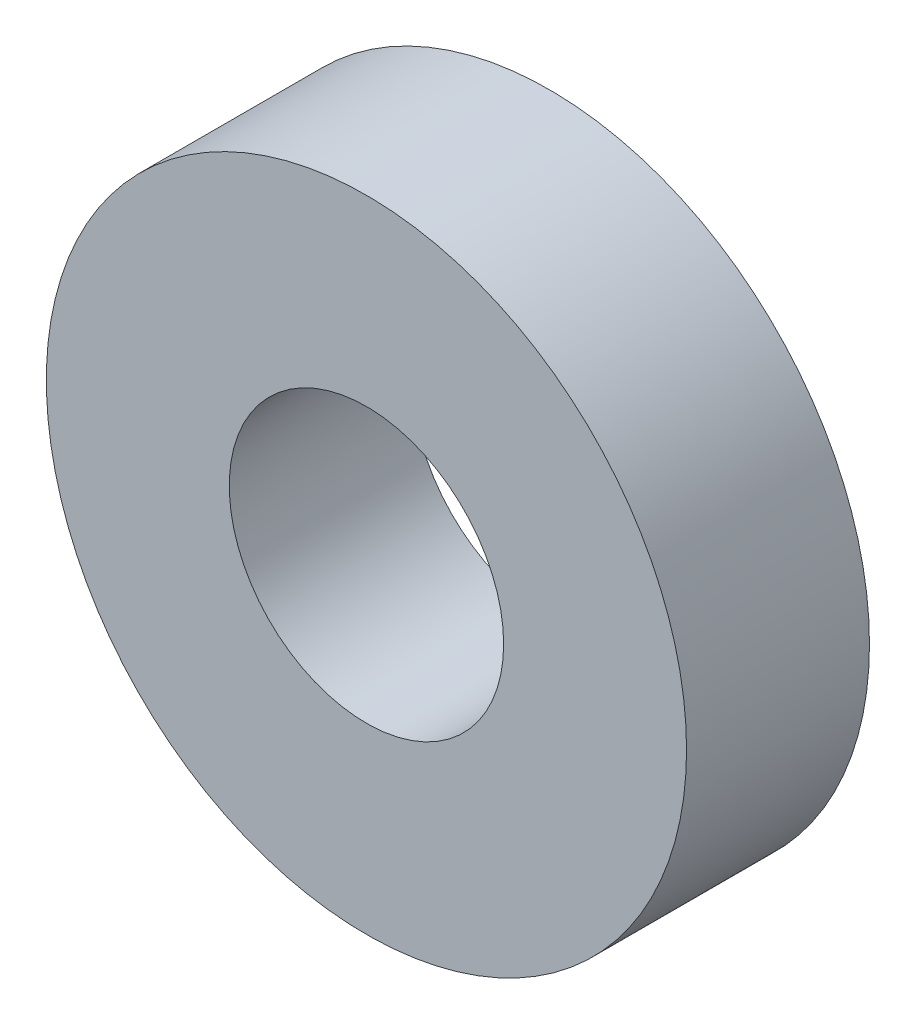
ISO-10303-21;
HEADER;
FILE_DESCRIPTION(('STEP AP214'),'2;1');
FILE_NAME('part.step','',(''),(''),'','','');
FILE_SCHEMA(('AUTOMOTIVE_DESIGN { 1 0 10303 214 1 1 1 1 }'));
ENDSEC;
DATA;
#1=APPLICATION_CONTEXT('core data for automotive mechanical design processes');
#2=APPLICATION_PROTOCOL_DEFINITION('international standard','automotive_design',2000,#1);
#3=PRODUCT_CONTEXT('',#1,'mechanical');
#4=PRODUCT('Part','Part','',(#3));
#5=PRODUCT_RELATED_PRODUCT_CATEGORY('part','',(#4));
#6=PRODUCT_DEFINITION_FORMATION('','',#4);
#7=PRODUCT_DEFINITION_CONTEXT('part definition',#1,'design');
#8=PRODUCT_DEFINITION('design','',#6,#7);
#9=PRODUCT_DEFINITION_SHAPE('','',#8);
#10=(LENGTH_UNIT() NAMED_UNIT(*) SI_UNIT(.MILLI.,.METRE.));
#11=(NAMED_UNIT(*) PLANE_ANGLE_UNIT() SI_UNIT($,.RADIAN.));
#12=(NAMED_UNIT(*) SI_UNIT($,.STERADIAN.) SOLID_ANGLE_UNIT());
#13=UNCERTAINTY_MEASURE_WITH_UNIT(LENGTH_MEASURE(1.E-05),#10,'distance_accuracy_value','');
#14=(GEOMETRIC_REPRESENTATION_CONTEXT(3) GLOBAL_UNCERTAINTY_ASSIGNED_CONTEXT((#13)) GLOBAL_UNIT_ASSIGNED_CONTEXT((#10,
#11,#12)) REPRESENTATION_CONTEXT('',''));
#15=CARTESIAN_POINT('',(0.,0.,0.));
#16=DIRECTION('',(0.,0.,1.));
#17=DIRECTION('',(1.,0.,0.));
#18=AXIS2_PLACEMENT_3D('',#15,#16,#17);
#19=CARTESIAN_POINT('',(0.,0.,2.54));
#20=DIRECTION('',(0.,0.,1.));
#21=DIRECTION('',(1.,0.,0.));
#22=AXIS2_PLACEMENT_3D('',#19,#20,#21);
#23=PLANE('',#22);
#24=CARTESIAN_POINT('',(0.,0.,2.54));
#25=DIRECTION('',(0.,0.,1.));
#26=DIRECTION('',(1.,0.,0.));
#27=AXIS2_PLACEMENT_3D('',#24,#25,#26);
#28=CIRCLE('',#27,4.445);
#29=CARTESIAN_POINT('',(4.445,0.,2.54));
#30=VERTEX_POINT('',#29);
#31=EDGE_CURVE('E10',#30,#30,#28,.T.);
#32=ORIENTED_EDGE('',*,*,#31,.T.);
#33=EDGE_LOOP('',(#32));
#34=FACE_BOUND('',#33,.T.);
#35=CARTESIAN_POINT('',(0.,0.,2.54));
#36=DIRECTION('',(0.,0.,1.));
#37=DIRECTION('',(1.,0.,0.));
#38=AXIS2_PLACEMENT_3D('',#35,#36,#37);
#39=CIRCLE('',#38,1.905);
#40=CARTESIAN_POINT('',(1.905,0.,2.54));
#41=VERTEX_POINT('',#40);
#42=EDGE_CURVE('E50',#41,#41,#39,.T.);
#43=ORIENTED_EDGE('',*,*,#42,.F.);
#44=EDGE_LOOP('',(#43));
#45=FACE_BOUND('',#44,.T.);
#46=ADVANCED_FACE('F37',(#34,#45),#23,.T.);
#47=CARTESIAN_POINT('',(0.,0.,0.));
#48=DIRECTION('',(0.,0.,1.));
#49=DIRECTION('',(1.,0.,0.));
#50=AXIS2_PLACEMENT_3D('',#47,#48,#49);
#51=PLANE('',#50);
#52=CARTESIAN_POINT('',(0.,0.,0.));
#53=DIRECTION('',(0.,0.,1.));
#54=DIRECTION('',(1.,0.,0.));
#55=AXIS2_PLACEMENT_3D('',#52,#53,#54);
#56=CIRCLE('',#55,4.445);
#57=CARTESIAN_POINT('',(4.445,0.,0.));
#58=VERTEX_POINT('',#57);
#59=EDGE_CURVE('E41',#58,#58,#56,.T.);
#60=ORIENTED_EDGE('',*,*,#59,.F.);
#61=EDGE_LOOP('',(#60));
#62=FACE_BOUND('',#61,.T.);
#63=CARTESIAN_POINT('',(0.,0.,0.));
#64=DIRECTION('',(0.,0.,1.));
#65=DIRECTION('',(1.,0.,0.));
#66=AXIS2_PLACEMENT_3D('',#63,#64,#65);
#67=CIRCLE('',#66,1.905);
#68=CARTESIAN_POINT('',(1.905,0.,0.));
#69=VERTEX_POINT('',#68);
#70=EDGE_CURVE('E52',#69,#69,#67,.T.);
#71=ORIENTED_EDGE('',*,*,#70,.T.);
#72=EDGE_LOOP('',(#71));
#73=FACE_BOUND('',#72,.T.);
#74=ADVANCED_FACE('F64',(#62,#73),#51,.F.);
#75=CARTESIAN_POINT('',(0.,0.,2.54));
#76=DIRECTION('',(0.,0.,-1.));
#77=DIRECTION('',(-1.,0.,0.));
#78=AXIS2_PLACEMENT_3D('',#75,#76,#77);
#79=CYLINDRICAL_SURFACE('',#78,4.445);
#80=ORIENTED_EDGE('',*,*,#31,.F.);
#81=EDGE_LOOP('',(#80));
#82=FACE_BOUND('',#81,.T.);
#83=ORIENTED_EDGE('',*,*,#59,.T.);
#84=EDGE_LOOP('',(#83));
#85=FACE_BOUND('',#84,.T.);
#86=ADVANCED_FACE('F39',(#82,#85),#79,.T.);
#87=CARTESIAN_POINT('',(0.,0.,2.54));
#88=DIRECTION('',(0.,0.,-1.));
#89=DIRECTION('',(-1.,0.,0.));
#90=AXIS2_PLACEMENT_3D('',#87,#88,#89);
#91=CYLINDRICAL_SURFACE('',#90,1.905);
#92=ORIENTED_EDGE('',*,*,#42,.T.);
#93=EDGE_LOOP('',(#92));
#94=FACE_BOUND('',#93,.T.);
#95=ORIENTED_EDGE('',*,*,#70,.F.);
#96=EDGE_LOOP('',(#95));
#97=FACE_BOUND('',#96,.T.);
#98=ADVANCED_FACE('F60',(#94,#97),#91,.F.);
#99=CLOSED_SHELL('',(#46,#74,#86,#98));
#100=MANIFOLD_SOLID_BREP('B2',#99);
#101=ADVANCED_BREP_SHAPE_REPRESENTATION('',(#18,#100),#14);
#102=SHAPE_DEFINITION_REPRESENTATION(#9,#101);
ENDSEC;
END-ISO-10303-21;
